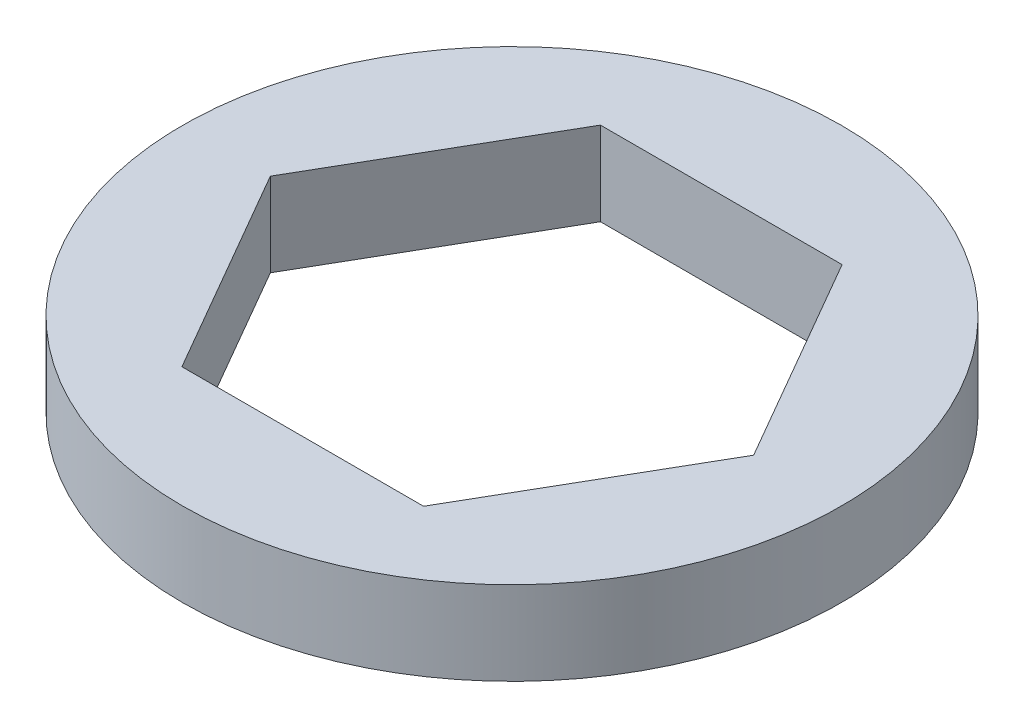
ISO-10303-21;
HEADER;
FILE_DESCRIPTION(('STEP AP214'),'2;1');
FILE_NAME('part.step','',(''),(''),'','','');
FILE_SCHEMA(('AUTOMOTIVE_DESIGN { 1 0 10303 214 1 1 1 1 }'));
ENDSEC;
DATA;
#1=APPLICATION_CONTEXT('core data for automotive mechanical design processes');
#2=APPLICATION_PROTOCOL_DEFINITION('international standard','automotive_design',2000,#1);
#3=PRODUCT_CONTEXT('',#1,'mechanical');
#4=PRODUCT('Part','Part','',(#3));
#5=PRODUCT_RELATED_PRODUCT_CATEGORY('part','',(#4));
#6=PRODUCT_DEFINITION_FORMATION('','',#4);
#7=PRODUCT_DEFINITION_CONTEXT('part definition',#1,'design');
#8=PRODUCT_DEFINITION('design','',#6,#7);
#9=PRODUCT_DEFINITION_SHAPE('','',#8);
#10=(LENGTH_UNIT() NAMED_UNIT(*) SI_UNIT(.MILLI.,.METRE.));
#11=(NAMED_UNIT(*) PLANE_ANGLE_UNIT() SI_UNIT($,.RADIAN.));
#12=(NAMED_UNIT(*) SI_UNIT($,.STERADIAN.) SOLID_ANGLE_UNIT());
#13=UNCERTAINTY_MEASURE_WITH_UNIT(LENGTH_MEASURE(1.E-05),#10,'distance_accuracy_value','');
#14=(GEOMETRIC_REPRESENTATION_CONTEXT(3) GLOBAL_UNCERTAINTY_ASSIGNED_CONTEXT((#13)) GLOBAL_UNIT_ASSIGNED_CONTEXT((#10,
#11,#12)) REPRESENTATION_CONTEXT('',''));
#15=CARTESIAN_POINT('',(0.,0.,0.));
#16=DIRECTION('',(0.,0.,1.));
#17=DIRECTION('',(1.,0.,0.));
#18=AXIS2_PLACEMENT_3D('',#15,#16,#17);
#19=CARTESIAN_POINT('',(0.,2.54,0.));
#20=DIRECTION('',(0.,1.,0.));
#21=DIRECTION('',(0.,0.,1.));
#22=AXIS2_PLACEMENT_3D('',#19,#20,#21);
#23=PLANE('',#22);
#24=CARTESIAN_POINT('',(0.,2.54,0.));
#25=DIRECTION('',(0.,1.,0.));
#26=DIRECTION('',(0.,0.,1.));
#27=AXIS2_PLACEMENT_3D('',#24,#25,#26);
#28=CIRCLE('',#27,10.);
#29=CARTESIAN_POINT('',(0.,2.54,10.));
#30=VERTEX_POINT('',#29);
#31=EDGE_CURVE('E11',#30,#30,#28,.T.);
#32=ORIENTED_EDGE('',*,*,#31,.T.);
#33=EDGE_LOOP('',(#32));
#34=FACE_BOUND('',#33,.T.);
#35=DIRECTION('',(0.5,0.,0.866025403784439));
#36=VECTOR('',#35,1.);
#37=CARTESIAN_POINT('',(-7.33234841870825,2.54,0.));
#38=LINE('',#37,#36);
#39=CARTESIAN_POINT('',(-7.33234841870825,2.54,0.));
#40=VERTEX_POINT('',#39);
#41=CARTESIAN_POINT('',(-3.66617420935413,2.54,6.35));
#42=VERTEX_POINT('',#41);
#43=EDGE_CURVE('E94',#40,#42,#38,.T.);
#44=ORIENTED_EDGE('',*,*,#43,.F.);
#45=DIRECTION('',(-0.5,0.,0.866025403784439));
#46=VECTOR('',#45,1.);
#47=CARTESIAN_POINT('',(-3.66617420935412,2.54,-6.35));
#48=LINE('',#47,#46);
#49=CARTESIAN_POINT('',(-3.66617420935412,2.54,-6.35));
#50=VERTEX_POINT('',#49);
#51=EDGE_CURVE('E86',#50,#40,#48,.T.);
#52=ORIENTED_EDGE('',*,*,#51,.F.);
#53=DIRECTION('',(-1.,0.,0.));
#54=VECTOR('',#53,1.);
#55=CARTESIAN_POINT('',(3.66617420935412,2.54,-6.35));
#56=LINE('',#55,#54);
#57=CARTESIAN_POINT('',(3.66617420935412,2.54,-6.35));
#58=VERTEX_POINT('',#57);
#59=EDGE_CURVE('E114',#58,#50,#56,.T.);
#60=ORIENTED_EDGE('',*,*,#59,.F.);
#61=DIRECTION('',(-0.5,0.,-0.866025403784439));
#62=VECTOR('',#61,1.);
#63=CARTESIAN_POINT('',(7.33234841870825,2.54,0.));
#64=LINE('',#63,#62);
#65=CARTESIAN_POINT('',(7.33234841870825,2.54,0.));
#66=VERTEX_POINT('',#65);
#67=EDGE_CURVE('E112',#66,#58,#64,.T.);
#68=ORIENTED_EDGE('',*,*,#67,.F.);
#69=DIRECTION('',(0.5,0.,-0.866025403784439));
#70=VECTOR('',#69,1.);
#71=CARTESIAN_POINT('',(3.66617420935412,2.54,6.35));
#72=LINE('',#71,#70);
#73=CARTESIAN_POINT('',(3.66617420935412,2.54,6.35));
#74=VERTEX_POINT('',#73);
#75=EDGE_CURVE('E108',#74,#66,#72,.T.);
#76=ORIENTED_EDGE('',*,*,#75,.F.);
#77=DIRECTION('',(1.,0.,0.));
#78=VECTOR('',#77,1.);
#79=CARTESIAN_POINT('',(-3.66617420935413,2.54,6.35));
#80=LINE('',#79,#78);
#81=EDGE_CURVE('E106',#42,#74,#80,.T.);
#82=ORIENTED_EDGE('',*,*,#81,.F.);
#83=EDGE_LOOP('',(#44,#52,#60,#68,#76,#82));
#84=FACE_BOUND('',#83,.T.);
#85=ADVANCED_FACE('F33',(#34,#84),#23,.T.);
#86=CARTESIAN_POINT('',(0.,0.,0.));
#87=DIRECTION('',(0.,1.,0.));
#88=DIRECTION('',(0.,0.,1.));
#89=AXIS2_PLACEMENT_3D('',#86,#87,#88);
#90=PLANE('',#89);
#91=CARTESIAN_POINT('',(0.,0.,0.));
#92=DIRECTION('',(0.,1.,0.));
#93=DIRECTION('',(0.,0.,1.));
#94=AXIS2_PLACEMENT_3D('',#91,#92,#93);
#95=CIRCLE('',#94,10.);
#96=CARTESIAN_POINT('',(0.,0.,10.));
#97=VERTEX_POINT('',#96);
#98=EDGE_CURVE('E37',#97,#97,#95,.T.);
#99=ORIENTED_EDGE('',*,*,#98,.F.);
#100=EDGE_LOOP('',(#99));
#101=FACE_BOUND('',#100,.T.);
#102=DIRECTION('',(-0.5,0.,0.866025403784439));
#103=VECTOR('',#102,1.);
#104=CARTESIAN_POINT('',(-3.66617420935412,0.,-6.35));
#105=LINE('',#104,#103);
#106=CARTESIAN_POINT('',(-3.66617420935412,0.,-6.35));
#107=VERTEX_POINT('',#106);
#108=CARTESIAN_POINT('',(-7.33234841870825,0.,0.));
#109=VERTEX_POINT('',#108);
#110=EDGE_CURVE('E56',#107,#109,#105,.T.);
#111=ORIENTED_EDGE('',*,*,#110,.T.);
#112=DIRECTION('',(0.5,0.,0.866025403784439));
#113=VECTOR('',#112,1.);
#114=CARTESIAN_POINT('',(-7.33234841870825,0.,0.));
#115=LINE('',#114,#113);
#116=CARTESIAN_POINT('',(-3.66617420935413,0.,6.35));
#117=VERTEX_POINT('',#116);
#118=EDGE_CURVE('E101',#109,#117,#115,.T.);
#119=ORIENTED_EDGE('',*,*,#118,.T.);
#120=DIRECTION('',(1.,0.,0.));
#121=VECTOR('',#120,1.);
#122=CARTESIAN_POINT('',(-3.66617420935413,0.,6.35));
#123=LINE('',#122,#121);
#124=CARTESIAN_POINT('',(3.66617420935412,0.,6.35));
#125=VERTEX_POINT('',#124);
#126=EDGE_CURVE('E118',#117,#125,#123,.T.);
#127=ORIENTED_EDGE('',*,*,#126,.T.);
#128=DIRECTION('',(0.5,0.,-0.866025403784439));
#129=VECTOR('',#128,1.);
#130=CARTESIAN_POINT('',(3.66617420935412,0.,6.35));
#131=LINE('',#130,#129);
#132=CARTESIAN_POINT('',(7.33234841870825,0.,0.));
#133=VERTEX_POINT('',#132);
#134=EDGE_CURVE('E121',#125,#133,#131,.T.);
#135=ORIENTED_EDGE('',*,*,#134,.T.);
#136=DIRECTION('',(-0.5,0.,-0.866025403784439));
#137=VECTOR('',#136,1.);
#138=CARTESIAN_POINT('',(7.33234841870825,0.,0.));
#139=LINE('',#138,#137);
#140=CARTESIAN_POINT('',(3.66617420935412,0.,-6.35));
#141=VERTEX_POINT('',#140);
#142=EDGE_CURVE('E124',#133,#141,#139,.T.);
#143=ORIENTED_EDGE('',*,*,#142,.T.);
#144=DIRECTION('',(-1.,0.,0.));
#145=VECTOR('',#144,1.);
#146=CARTESIAN_POINT('',(3.66617420935412,0.,-6.35));
#147=LINE('',#146,#145);
#148=EDGE_CURVE('E95',#141,#107,#147,.T.);
#149=ORIENTED_EDGE('',*,*,#148,.T.);
#150=EDGE_LOOP('',(#111,#119,#127,#135,#143,#149));
#151=FACE_BOUND('',#150,.T.);
#152=ADVANCED_FACE('F141',(#101,#151),#90,.F.);
#153=CARTESIAN_POINT('',(0.,2.54,0.));
#154=DIRECTION('',(0.,-1.,0.));
#155=DIRECTION('',(0.,0.,-1.));
#156=AXIS2_PLACEMENT_3D('',#153,#154,#155);
#157=CYLINDRICAL_SURFACE('',#156,10.);
#158=ORIENTED_EDGE('',*,*,#31,.F.);
#159=EDGE_LOOP('',(#158));
#160=FACE_BOUND('',#159,.T.);
#161=ORIENTED_EDGE('',*,*,#98,.T.);
#162=EDGE_LOOP('',(#161));
#163=FACE_BOUND('',#162,.T.);
#164=ADVANCED_FACE('F35',(#160,#163),#157,.T.);
#165=CARTESIAN_POINT('',(-3.66617420935412,2.54,-6.35));
#166=DIRECTION('',(0.866025403784438,0.,0.5));
#167=DIRECTION('',(0.5,0.,-0.866025403784439));
#168=AXIS2_PLACEMENT_3D('',#165,#166,#167);
#169=PLANE('',#168);
#170=ORIENTED_EDGE('',*,*,#110,.F.);
#171=DIRECTION('',(0.,-1.,0.));
#172=VECTOR('',#171,1.);
#173=CARTESIAN_POINT('',(-3.66617420935412,2.54,-6.35));
#174=LINE('',#173,#172);
#175=EDGE_CURVE('E90',#50,#107,#174,.T.);
#176=ORIENTED_EDGE('',*,*,#175,.F.);
#177=ORIENTED_EDGE('',*,*,#51,.T.);
#178=DIRECTION('',(0.,-1.,0.));
#179=VECTOR('',#178,1.);
#180=CARTESIAN_POINT('',(-7.33234841870825,2.54,0.));
#181=LINE('',#180,#179);
#182=EDGE_CURVE('E89',#40,#109,#181,.T.);
#183=ORIENTED_EDGE('',*,*,#182,.T.);
#184=EDGE_LOOP('',(#170,#176,#177,#183));
#185=FACE_BOUND('',#184,.T.);
#186=ADVANCED_FACE('F88',(#185),#169,.T.);
#187=CARTESIAN_POINT('',(-7.33234841870825,2.54,0.));
#188=DIRECTION('',(0.866025403784439,0.,-0.5));
#189=DIRECTION('',(-0.5,0.,-0.866025403784439));
#190=AXIS2_PLACEMENT_3D('',#187,#188,#189);
#191=PLANE('',#190);
#192=ORIENTED_EDGE('',*,*,#118,.F.);
#193=ORIENTED_EDGE('',*,*,#182,.F.);
#194=ORIENTED_EDGE('',*,*,#43,.T.);
#195=DIRECTION('',(0.,-1.,0.));
#196=VECTOR('',#195,1.);
#197=CARTESIAN_POINT('',(-3.66617420935413,2.54,6.35));
#198=LINE('',#197,#196);
#199=EDGE_CURVE('E102',#42,#117,#198,.T.);
#200=ORIENTED_EDGE('',*,*,#199,.T.);
#201=EDGE_LOOP('',(#192,#193,#194,#200));
#202=FACE_BOUND('',#201,.T.);
#203=ADVANCED_FACE('F98',(#202),#191,.T.);
#204=CARTESIAN_POINT('',(-3.66617420935413,2.54,6.35));
#205=DIRECTION('',(0.,0.,-1.));
#206=DIRECTION('',(-1.,0.,0.));
#207=AXIS2_PLACEMENT_3D('',#204,#205,#206);
#208=PLANE('',#207);
#209=ORIENTED_EDGE('',*,*,#126,.F.);
#210=ORIENTED_EDGE('',*,*,#199,.F.);
#211=ORIENTED_EDGE('',*,*,#81,.T.);
#212=DIRECTION('',(0.,-1.,0.));
#213=VECTOR('',#212,1.);
#214=CARTESIAN_POINT('',(3.66617420935412,2.54,6.35));
#215=LINE('',#214,#213);
#216=EDGE_CURVE('E133',#74,#125,#215,.T.);
#217=ORIENTED_EDGE('',*,*,#216,.T.);
#218=EDGE_LOOP('',(#209,#210,#211,#217));
#219=FACE_BOUND('',#218,.T.);
#220=ADVANCED_FACE('F137',(#219),#208,.T.);
#221=CARTESIAN_POINT('',(3.66617420935412,2.54,6.35));
#222=DIRECTION('',(-0.866025403784439,0.,-0.5));
#223=DIRECTION('',(-0.5,0.,0.866025403784439));
#224=AXIS2_PLACEMENT_3D('',#221,#222,#223);
#225=PLANE('',#224);
#226=ORIENTED_EDGE('',*,*,#134,.F.);
#227=ORIENTED_EDGE('',*,*,#216,.F.);
#228=ORIENTED_EDGE('',*,*,#75,.T.);
#229=DIRECTION('',(0.,-1.,0.));
#230=VECTOR('',#229,1.);
#231=CARTESIAN_POINT('',(7.33234841870825,2.54,0.));
#232=LINE('',#231,#230);
#233=EDGE_CURVE('E131',#66,#133,#232,.T.);
#234=ORIENTED_EDGE('',*,*,#233,.T.);
#235=EDGE_LOOP('',(#226,#227,#228,#234));
#236=FACE_BOUND('',#235,.T.);
#237=ADVANCED_FACE('F149',(#236),#225,.T.);
#238=CARTESIAN_POINT('',(7.33234841870825,2.54,0.));
#239=DIRECTION('',(-0.866025403784439,0.,0.5));
#240=DIRECTION('',(0.5,0.,0.866025403784439));
#241=AXIS2_PLACEMENT_3D('',#238,#239,#240);
#242=PLANE('',#241);
#243=ORIENTED_EDGE('',*,*,#142,.F.);
#244=ORIENTED_EDGE('',*,*,#233,.F.);
#245=ORIENTED_EDGE('',*,*,#67,.T.);
#246=DIRECTION('',(0.,-1.,0.));
#247=VECTOR('',#246,1.);
#248=CARTESIAN_POINT('',(3.66617420935412,2.54,-6.35));
#249=LINE('',#248,#247);
#250=EDGE_CURVE('E48',#58,#141,#249,.T.);
#251=ORIENTED_EDGE('',*,*,#250,.T.);
#252=EDGE_LOOP('',(#243,#244,#245,#251));
#253=FACE_BOUND('',#252,.T.);
#254=ADVANCED_FACE('F147',(#253),#242,.T.);
#255=CARTESIAN_POINT('',(3.66617420935412,2.54,-6.35));
#256=DIRECTION('',(0.,0.,1.));
#257=DIRECTION('',(1.,0.,0.));
#258=AXIS2_PLACEMENT_3D('',#255,#256,#257);
#259=PLANE('',#258);
#260=ORIENTED_EDGE('',*,*,#148,.F.);
#261=ORIENTED_EDGE('',*,*,#250,.F.);
#262=ORIENTED_EDGE('',*,*,#59,.T.);
#263=ORIENTED_EDGE('',*,*,#175,.T.);
#264=EDGE_LOOP('',(#260,#261,#262,#263));
#265=FACE_BOUND('',#264,.T.);
#266=ADVANCED_FACE('F143',(#265),#259,.T.);
#267=CLOSED_SHELL('',(#85,#152,#164,#186,#203,#220,#237,#254,#266));
#268=MANIFOLD_SOLID_BREP('B2',#267);
#269=ADVANCED_BREP_SHAPE_REPRESENTATION('',(#18,#268),#14);
#270=SHAPE_DEFINITION_REPRESENTATION(#9,#269);
ENDSEC;
END-ISO-10303-21;
